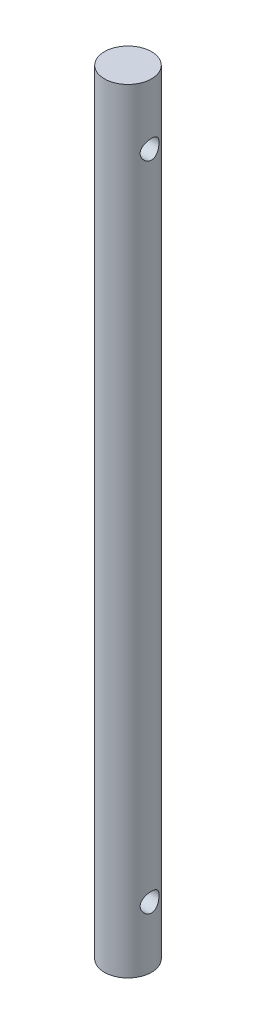
ISO-10303-21;
HEADER;
FILE_DESCRIPTION(('STEP AP214'),'2;1');
FILE_NAME('part.step','',(''),(''),'','','');
FILE_SCHEMA(('AUTOMOTIVE_DESIGN { 1 0 10303 214 1 1 1 1 }'));
ENDSEC;
DATA;
#1=APPLICATION_CONTEXT('core data for automotive mechanical design processes');
#2=APPLICATION_PROTOCOL_DEFINITION('international standard','automotive_design',2000,#1);
#3=PRODUCT_CONTEXT('',#1,'mechanical');
#4=PRODUCT('Part','Part','',(#3));
#5=PRODUCT_RELATED_PRODUCT_CATEGORY('part','',(#4));
#6=PRODUCT_DEFINITION_FORMATION('','',#4);
#7=PRODUCT_DEFINITION_CONTEXT('part definition',#1,'design');
#8=PRODUCT_DEFINITION('design','',#6,#7);
#9=PRODUCT_DEFINITION_SHAPE('','',#8);
#10=(LENGTH_UNIT() NAMED_UNIT(*) SI_UNIT(.MILLI.,.METRE.));
#11=(NAMED_UNIT(*) PLANE_ANGLE_UNIT() SI_UNIT($,.RADIAN.));
#12=(NAMED_UNIT(*) SI_UNIT($,.STERADIAN.) SOLID_ANGLE_UNIT());
#13=UNCERTAINTY_MEASURE_WITH_UNIT(LENGTH_MEASURE(1.E-05),#10,'distance_accuracy_value','');
#14=(GEOMETRIC_REPRESENTATION_CONTEXT(3) GLOBAL_UNCERTAINTY_ASSIGNED_CONTEXT((#13)) GLOBAL_UNIT_ASSIGNED_CONTEXT((#10,
#11,#12)) REPRESENTATION_CONTEXT('',''));
#15=CARTESIAN_POINT('',(0.,0.,0.));
#16=DIRECTION('',(0.,0.,1.));
#17=DIRECTION('',(1.,0.,0.));
#18=AXIS2_PLACEMENT_3D('',#15,#16,#17);
#19=CARTESIAN_POINT('',(0.,65.0875,0.));
#20=DIRECTION('',(0.,-1.,0.));
#21=DIRECTION('',(0.,0.,-1.));
#22=AXIS2_PLACEMENT_3D('',#19,#20,#21);
#23=CYLINDRICAL_SURFACE('',#22,3.9624);
#24=CARTESIAN_POINT('',(-3.9624,-56.4261,0.));
#25=CARTESIAN_POINT('',(-3.96239416664373,-56.4260921193011,-0.0853117270718665));
#26=CARTESIAN_POINT('',(-3.95961253187258,-56.4191820472601,-0.170771012783031));
#27=CARTESIAN_POINT('',(-3.94875664272095,-56.3917813319248,-0.339280209794603));
#28=CARTESIAN_POINT('',(-3.94066802223273,-56.3712538243066,-0.422322940365623));
#29=CARTESIAN_POINT('',(-3.92006972049317,-56.3174852905155,-0.583289939692177));
#30=CARTESIAN_POINT('',(-3.90757454272,-56.2842859425204,-0.661230017057725));
#31=CARTESIAN_POINT('',(-3.87939329710751,-56.206281808147,-0.810363301587508));
#32=CARTESIAN_POINT('',(-3.863708331934,-56.1614810307651,-0.881558827817694));
#33=CARTESIAN_POINT('',(-3.82990464333274,-56.0593098336145,-1.01864732948284));
#34=CARTESIAN_POINT('',(-3.81171021752443,-56.0014813356325,-1.08418010359646));
#35=CARTESIAN_POINT('',(-3.7752829774358,-55.8758631362575,-1.20492218930694));
#36=CARTESIAN_POINT('',(-3.75705014873227,-55.8080685767368,-1.26012643608791));
#37=CARTESIAN_POINT('',(-3.72170442663272,-55.660764437137,-1.36107386243811));
#38=CARTESIAN_POINT('',(-3.70467796939796,-55.5808667700026,-1.40628412127964));
#39=CARTESIAN_POINT('',(-3.67486086596433,-55.4138169679372,-1.48246329056709));
#40=CARTESIAN_POINT('',(-3.66206820228051,-55.3266683130901,-1.51343898680088));
#41=CARTESIAN_POINT('',(-3.64298009307872,-55.1517293799379,-1.55881183659324));
#42=CARTESIAN_POINT('',(-3.63641570103485,-55.0641484051034,-1.57389868874412));
#43=CARTESIAN_POINT('',(-3.62974807106187,-54.8874708701643,-1.58921987839996));
#44=CARTESIAN_POINT('',(-3.62964164180919,-54.7983750804086,-1.58946155192944));
#45=CARTESIAN_POINT('',(-3.6356726055801,-54.6278342294068,-1.575608087631));
#46=CARTESIAN_POINT('',(-3.64137433896396,-54.5462895020417,-1.56251330699091));
#47=CARTESIAN_POINT('',(-3.65764778306397,-54.3866700246874,-1.5240270084585));
#48=CARTESIAN_POINT('',(-3.66822034656052,-54.308595884951,-1.49863333724793));
#49=CARTESIAN_POINT('',(-3.69327658525766,-54.1562469972858,-1.43578621930772));
#50=CARTESIAN_POINT('',(-3.7078358006729,-54.0820825564207,-1.39809683496273));
#51=CARTESIAN_POINT('',(-3.73920425029953,-53.9408576430005,-1.31189385068063));
#52=CARTESIAN_POINT('',(-3.75601433031439,-53.8737998579535,-1.263376177224));
#53=CARTESIAN_POINT('',(-3.79157859533404,-53.7432177203381,-1.15247025125587));
#54=CARTESIAN_POINT('',(-3.81038243478568,-53.6803709868535,-1.08929797701746));
#55=CARTESIAN_POINT('',(-3.84670714404858,-53.565946296881,-0.953110948774039));
#56=CARTESIAN_POINT('',(-3.86422775624386,-53.5143705990245,-0.880094226746655));
#57=CARTESIAN_POINT('',(-3.89645338462923,-53.4230588621464,-0.724363732588357));
#58=CARTESIAN_POINT('',(-3.91109551133595,-53.3835785435517,-0.64148605770065));
#59=CARTESIAN_POINT('',(-3.93543864002888,-53.3193537921091,-0.469530085969014));
#60=CARTESIAN_POINT('',(-3.94514216003095,-53.2946018487075,-0.380454975359991));
#61=CARTESIAN_POINT('',(-3.95805539170234,-53.2619087183818,-0.204311847288934));
#62=CARTESIAN_POINT('',(-3.96161635318634,-53.2530569422447,-0.11743850460253));
#63=CARTESIAN_POINT('',(-3.96295024554235,-53.2497256723844,0.0566169135851256));
#64=CARTESIAN_POINT('',(-3.96072468264188,-53.2552424385421,0.143798902846544));
#65=CARTESIAN_POINT('',(-3.95096541555836,-53.279822787761,0.311864203819767));
#66=CARTESIAN_POINT('',(-3.94367566936803,-53.298264101533,0.392854247186952));
#67=CARTESIAN_POINT('',(-3.92477456539392,-53.3473226223705,0.550515216479772));
#68=CARTESIAN_POINT('',(-3.9131626527772,-53.3779413926807,0.62718558643701));
#69=CARTESIAN_POINT('',(-3.88630174678252,-53.4514847754524,0.776671825040636));
#70=CARTESIAN_POINT('',(-3.87095230097636,-53.4947573858859,0.84929786524366));
#71=CARTESIAN_POINT('',(-3.83827939599824,-53.5919941364002,0.986513042497237));
#72=CARTESIAN_POINT('',(-3.82095514553132,-53.6459625686897,1.05109893605944));
#73=CARTESIAN_POINT('',(-3.78479622435235,-53.767250435357,1.17488814946077));
#74=CARTESIAN_POINT('',(-3.76593750910618,-53.8352173731056,1.23345169378678));
#75=CARTESIAN_POINT('',(-3.72989598565993,-53.9803463207111,1.33849995110219));
#76=CARTESIAN_POINT('',(-3.71271345763364,-54.0575098630029,1.38498264693781));
#77=CARTESIAN_POINT('',(-3.68194013043205,-54.2200216147768,1.46485133239264));
#78=CARTESIAN_POINT('',(-3.66838637510373,-54.3054429536227,1.49810381591319));
#79=CARTESIAN_POINT('',(-3.64698112621987,-54.481379776943,1.5494941460913));
#80=CARTESIAN_POINT('',(-3.63912540623532,-54.5718914319467,1.56764319695997));
#81=CARTESIAN_POINT('',(-3.63061804319504,-54.7484018207046,1.58723971665741));
#82=CARTESIAN_POINT('',(-3.62948746901891,-54.8342549205638,1.58979784556331));
#83=CARTESIAN_POINT('',(-3.63330307077312,-55.0051066827267,1.58105828726621));
#84=CARTESIAN_POINT('',(-3.63824846948727,-55.0901054529112,1.56976237222211));
#85=CARTESIAN_POINT('',(-3.65323574640425,-55.2533688823369,1.53454341699212));
#86=CARTESIAN_POINT('',(-3.66306695290778,-55.3317669177528,1.51114082490251));
#87=CARTESIAN_POINT('',(-3.6865691443393,-55.4835546597423,1.45286057138561));
#88=CARTESIAN_POINT('',(-3.70024119029212,-55.556942975417,1.41797973865852));
#89=CARTESIAN_POINT('',(-3.73085856653308,-55.7012155266046,1.3354212120285));
#90=CARTESIAN_POINT('',(-3.74794669035745,-55.7717145315965,1.28712414414707));
#91=CARTESIAN_POINT('',(-3.78303688506396,-55.9039557778298,1.1800080827382));
#92=CARTESIAN_POINT('',(-3.8010392318397,-55.9656953540748,1.12118589927164));
#93=CARTESIAN_POINT('',(-3.83733892894263,-56.0827920022108,0.990129236409025));
#94=CARTESIAN_POINT('',(-3.85557912432534,-56.1374714588259,0.917270721586567));
#95=CARTESIAN_POINT('',(-3.88910173721633,-56.2338427946702,0.762721357089433));
#96=CARTESIAN_POINT('',(-3.90438277937339,-56.2755286402073,0.681026427799033));
#97=CARTESIAN_POINT('',(-3.93000833052496,-56.3437546874147,0.51261229318979));
#98=CARTESIAN_POINT('',(-3.94043917717235,-56.3705615688017,0.426014442405735));
#99=CARTESIAN_POINT('',(-3.95554325966711,-56.4090098677266,0.249201615949014));
#100=CARTESIAN_POINT('',(-3.96023475540089,-56.4206993883373,0.15899905958605));
#101=CARTESIAN_POINT('',(-3.96220361378713,-56.4256081223784,0.0457330899803838));
#102=CARTESIAN_POINT('',(-3.96240156390736,-56.4261021127945,0.0228718479665278));
#103=CARTESIAN_POINT('',(-3.9624,-56.4261,0.));
#104=B_SPLINE_CURVE_WITH_KNOTS('',3,(#24,#25,#26,#27,#28,#29,#30,#31,#32,#33,#34,#35,#36,#37,
#38,#39,#40,#41,#42,#43,#44,#45,#46,#47,#48,#49,#50,#51,#52,#53,#54,#55,#56,#57,#58,#59,#60,#61,
#62,#63,#64,#65,#66,#67,#68,#69,#70,#71,#72,#73,#74,#75,#76,#77,#78,#79,#80,#81,#82,#83,#84,#85,
#86,#87,#88,#89,#90,#91,#92,#93,#94,#95,#96,#97,#98,#99,#100,#101,#102,#103),.UNSPECIFIED.,.T.,
.F.,(4,2,2,2,2,2,2,2,2,2,2,2,2,2,2,2,2,2,2,2,2,2,2,2,2,2,2,2,2,2,2,2,2,2,2,2,2,2,2,4),(0.,
0.255873929494161,0.512443388183722,0.768176151866849,1.02382066204937,1.29047021362669,
1.55725018179777,1.83594980248179,2.11451642551444,2.38041834160663,2.64618885620301,
2.89339325556368,3.14064095169739,3.39294340285308,3.64534092872686,3.9173176007395,
4.18934872497149,4.46678713369947,4.74408394461068,5.0049220380686,5.2656922423836,
5.51470010088074,5.76373993534176,6.02040300035022,6.27716927297267,6.5509409411041,
6.82475829189514,7.10127261999538,7.37758163757343,7.63395264349522,7.89029085879073,
8.13642690153648,8.38263100588644,8.6429604535535,8.90336893560793,9.18073833868853,
9.45823634935121,9.73058529806194,10.0020654893605,10.0706646118358),.UNSPECIFIED.);
#105=CARTESIAN_POINT('',(-3.9624,-56.4261,0.));
#106=VERTEX_POINT('',#105);
#107=EDGE_CURVE('E37',#106,#106,#104,.T.);
#108=ORIENTED_EDGE('',*,*,#107,.T.);
#109=EDGE_LOOP('',(#108));
#110=FACE_BOUND('',#109,.T.);
#111=CARTESIAN_POINT('',(3.9624,-56.4261,0.));
#112=CARTESIAN_POINT('',(3.96239416664373,-56.4260921193011,0.0853117270718677));
#113=CARTESIAN_POINT('',(3.95961253187258,-56.4191820472601,0.170771012783033));
#114=CARTESIAN_POINT('',(3.94875664272095,-56.3917813319248,0.339280209794605));
#115=CARTESIAN_POINT('',(3.94066802223273,-56.3712538243066,0.422322940365624));
#116=CARTESIAN_POINT('',(3.92006972049317,-56.3174852905155,0.583289939692179));
#117=CARTESIAN_POINT('',(3.90757454272,-56.2842859425204,0.661230017057729));
#118=CARTESIAN_POINT('',(3.87939329710751,-56.206281808147,0.810363301587513));
#119=CARTESIAN_POINT('',(3.863708331934,-56.1614810307651,0.881558827817698));
#120=CARTESIAN_POINT('',(3.82990464333274,-56.0593098336145,1.01864732948285));
#121=CARTESIAN_POINT('',(3.81171021752442,-56.0014813356325,1.08418010359647));
#122=CARTESIAN_POINT('',(3.7752829774358,-55.8758631362575,1.20492218930694));
#123=CARTESIAN_POINT('',(3.75705014873227,-55.8080685767368,1.26012643608791));
#124=CARTESIAN_POINT('',(3.72170442663272,-55.660764437137,1.36107386243811));
#125=CARTESIAN_POINT('',(3.70467796939796,-55.5808667700026,1.40628412127964));
#126=CARTESIAN_POINT('',(3.67486086596433,-55.4138169679372,1.48246329056709));
#127=CARTESIAN_POINT('',(3.66206820228051,-55.3266683130901,1.51343898680088));
#128=CARTESIAN_POINT('',(3.64298009307872,-55.1517293799379,1.55881183659324));
#129=CARTESIAN_POINT('',(3.63641570103485,-55.0641484051034,1.57389868874411));
#130=CARTESIAN_POINT('',(3.62974807106188,-54.8874708701643,1.58921987839996));
#131=CARTESIAN_POINT('',(3.62964164180919,-54.7983750804086,1.58946155192944));
#132=CARTESIAN_POINT('',(3.6356726055801,-54.6278342294068,1.575608087631));
#133=CARTESIAN_POINT('',(3.64137433896395,-54.5462895020417,1.56251330699091));
#134=CARTESIAN_POINT('',(3.65764778306397,-54.3866700246874,1.5240270084585));
#135=CARTESIAN_POINT('',(3.66822034656052,-54.308595884951,1.49863333724793));
#136=CARTESIAN_POINT('',(3.69327658525766,-54.1562469972858,1.43578621930772));
#137=CARTESIAN_POINT('',(3.7078358006729,-54.0820825564207,1.39809683496273));
#138=CARTESIAN_POINT('',(3.73920425029953,-53.9408576430005,1.31189385068063));
#139=CARTESIAN_POINT('',(3.75601433031439,-53.8737998579535,1.263376177224));
#140=CARTESIAN_POINT('',(3.79157859533404,-53.7432177203381,1.15247025125587));
#141=CARTESIAN_POINT('',(3.81038243478568,-53.6803709868535,1.08929797701747));
#142=CARTESIAN_POINT('',(3.84670714404858,-53.565946296881,0.95311094877404));
#143=CARTESIAN_POINT('',(3.86422775624386,-53.5143705990245,0.880094226746653));
#144=CARTESIAN_POINT('',(3.89645338462923,-53.4230588621464,0.724363732588353));
#145=CARTESIAN_POINT('',(3.91109551133595,-53.3835785435517,0.641486057700646));
#146=CARTESIAN_POINT('',(3.93543864002888,-53.3193537921091,0.469530085969011));
#147=CARTESIAN_POINT('',(3.94514216003095,-53.2946018487075,0.380454975359989));
#148=CARTESIAN_POINT('',(3.95805539170234,-53.2619087183818,0.204311847288932));
#149=CARTESIAN_POINT('',(3.96161635318634,-53.2530569422447,0.117438504602528));
#150=CARTESIAN_POINT('',(3.96295024554235,-53.2497256723844,-0.0566169135851276));
#151=CARTESIAN_POINT('',(3.96072468264188,-53.2552424385421,-0.143798902846546));
#152=CARTESIAN_POINT('',(3.95096541555836,-53.279822787761,-0.311864203819769));
#153=CARTESIAN_POINT('',(3.94367566936803,-53.298264101533,-0.392854247186953));
#154=CARTESIAN_POINT('',(3.92477456539392,-53.3473226223705,-0.550515216479773));
#155=CARTESIAN_POINT('',(3.9131626527772,-53.3779413926807,-0.62718558643701));
#156=CARTESIAN_POINT('',(3.88630174678252,-53.4514847754524,-0.776671825040635));
#157=CARTESIAN_POINT('',(3.87095230097636,-53.4947573858859,-0.849297865243656));
#158=CARTESIAN_POINT('',(3.83827939599824,-53.5919941364002,-0.986513042497233));
#159=CARTESIAN_POINT('',(3.82095514553132,-53.6459625686897,-1.05109893605943));
#160=CARTESIAN_POINT('',(3.78479622435235,-53.767250435357,-1.17488814946077));
#161=CARTESIAN_POINT('',(3.76593750910618,-53.8352173731056,-1.23345169378678));
#162=CARTESIAN_POINT('',(3.72989598565993,-53.9803463207111,-1.3384999511022));
#163=CARTESIAN_POINT('',(3.71271345763364,-54.0575098630029,-1.38498264693781));
#164=CARTESIAN_POINT('',(3.68194013043205,-54.2200216147768,-1.46485133239264));
#165=CARTESIAN_POINT('',(3.66838637510373,-54.3054429536227,-1.49810381591319));
#166=CARTESIAN_POINT('',(3.64698112621987,-54.481379776943,-1.5494941460913));
#167=CARTESIAN_POINT('',(3.63912540623532,-54.5718914319467,-1.56764319695997));
#168=CARTESIAN_POINT('',(3.63061804319505,-54.7484018207046,-1.58723971665741));
#169=CARTESIAN_POINT('',(3.62948746901891,-54.8342549205638,-1.58979784556331));
#170=CARTESIAN_POINT('',(3.63330307077312,-55.0051066827267,-1.58105828726621));
#171=CARTESIAN_POINT('',(3.63824846948727,-55.0901054529112,-1.56976237222211));
#172=CARTESIAN_POINT('',(3.65323574640425,-55.2533688823369,-1.53454341699212));
#173=CARTESIAN_POINT('',(3.66306695290778,-55.3317669177528,-1.51114082490251));
#174=CARTESIAN_POINT('',(3.6865691443393,-55.4835546597423,-1.45286057138561));
#175=CARTESIAN_POINT('',(3.70024119029212,-55.556942975417,-1.41797973865852));
#176=CARTESIAN_POINT('',(3.73085856653308,-55.7012155266046,-1.3354212120285));
#177=CARTESIAN_POINT('',(3.74794669035745,-55.7717145315965,-1.28712414414707));
#178=CARTESIAN_POINT('',(3.78303688506396,-55.9039557778298,-1.1800080827382));
#179=CARTESIAN_POINT('',(3.8010392318397,-55.9656953540748,-1.12118589927164));
#180=CARTESIAN_POINT('',(3.83733892894263,-56.0827920022108,-0.990129236409029));
#181=CARTESIAN_POINT('',(3.85557912432534,-56.1374714588259,-0.917270721586572));
#182=CARTESIAN_POINT('',(3.88910173721633,-56.2338427946702,-0.762721357089438));
#183=CARTESIAN_POINT('',(3.90438277937339,-56.2755286402073,-0.681026427799036));
#184=CARTESIAN_POINT('',(3.93000833052496,-56.3437546874147,-0.512612293189792));
#185=CARTESIAN_POINT('',(3.94043917717235,-56.3705615688017,-0.426014442405737));
#186=CARTESIAN_POINT('',(3.95554325966711,-56.4090098677266,-0.249201615949017));
#187=CARTESIAN_POINT('',(3.96023475540089,-56.4206993883374,-0.158999059586053));
#188=CARTESIAN_POINT('',(3.96220361378713,-56.4256081223784,-0.045733089980386));
#189=CARTESIAN_POINT('',(3.96240156390736,-56.4261021127945,-0.0228718479665289));
#190=CARTESIAN_POINT('',(3.9624,-56.4261,0.));
#191=B_SPLINE_CURVE_WITH_KNOTS('',3,(#111,#112,#113,#114,#115,#116,#117,#118,#119,#120,#121,
#122,#123,#124,#125,#126,#127,#128,#129,#130,#131,#132,#133,#134,#135,#136,#137,#138,#139,#140,
#141,#142,#143,#144,#145,#146,#147,#148,#149,#150,#151,#152,#153,#154,#155,#156,#157,#158,#159,
#160,#161,#162,#163,#164,#165,#166,#167,#168,#169,#170,#171,#172,#173,#174,#175,#176,#177,#178,
#179,#180,#181,#182,#183,#184,#185,#186,#187,#188,#189,#190),.UNSPECIFIED.,.T.,.F.,(4,2,2,2,2,2,
2,2,2,2,2,2,2,2,2,2,2,2,2,2,2,2,2,2,2,2,2,2,2,2,2,2,2,2,2,2,2,2,2,4),(0.,0.255873929494164,
0.512443388183723,0.768176151866854,1.02382066204937,1.2904702136267,1.55725018179777,
1.83594980248179,2.11451642551444,2.38041834160661,2.646188856203,2.89339325556368,
3.14064095169739,3.39294340285308,3.64534092872686,3.91731760073949,4.18934872497149,
4.46678713369947,4.74408394461068,5.0049220380686,5.2656922423836,5.51470010088074,
5.76373993534176,6.02040300035021,6.27716927297267,6.5509409411041,6.82475829189514,
7.10127261999537,7.37758163757341,7.63395264349521,7.89029085879072,8.13642690153648,
8.38263100588644,8.64296045355349,8.90336893560792,9.18073833868852,9.45823634935121,
9.73058529806194,10.0020654893604,10.0706646118358),.UNSPECIFIED.);
#192=CARTESIAN_POINT('',(3.9624,-56.4261,0.));
#193=VERTEX_POINT('',#192);
#194=EDGE_CURVE('E89',#193,#193,#191,.T.);
#195=ORIENTED_EDGE('',*,*,#194,.T.);
#196=EDGE_LOOP('',(#195));
#197=FACE_BOUND('',#196,.T.);
#198=CARTESIAN_POINT('',(-3.9624,56.4261,0.));
#199=CARTESIAN_POINT('',(-3.96239416664373,56.4260921193011,0.0853117270718665));
#200=CARTESIAN_POINT('',(-3.95961253187258,56.4191820472601,0.170771012783031));
#201=CARTESIAN_POINT('',(-3.94875664272095,56.3917813319248,0.339280209794603));
#202=CARTESIAN_POINT('',(-3.94066802223273,56.3712538243066,0.422322940365623));
#203=CARTESIAN_POINT('',(-3.92006972049317,56.3174852905155,0.583289939692177));
#204=CARTESIAN_POINT('',(-3.90757454272,56.2842859425204,0.661230017057725));
#205=CARTESIAN_POINT('',(-3.87939329710751,56.206281808147,0.810363301587508));
#206=CARTESIAN_POINT('',(-3.863708331934,56.1614810307651,0.881558827817694));
#207=CARTESIAN_POINT('',(-3.82990464333274,56.0593098336145,1.01864732948284));
#208=CARTESIAN_POINT('',(-3.81171021752443,56.0014813356325,1.08418010359646));
#209=CARTESIAN_POINT('',(-3.7752829774358,55.8758631362575,1.20492218930694));
#210=CARTESIAN_POINT('',(-3.75705014873227,55.8080685767368,1.26012643608791));
#211=CARTESIAN_POINT('',(-3.72170442663272,55.660764437137,1.36107386243811));
#212=CARTESIAN_POINT('',(-3.70467796939796,55.5808667700026,1.40628412127964));
#213=CARTESIAN_POINT('',(-3.67486086596433,55.4138169679372,1.48246329056709));
#214=CARTESIAN_POINT('',(-3.66206820228051,55.3266683130901,1.51343898680088));
#215=CARTESIAN_POINT('',(-3.64298009307872,55.1517293799379,1.55881183659324));
#216=CARTESIAN_POINT('',(-3.63641570103485,55.0641484051034,1.57389868874412));
#217=CARTESIAN_POINT('',(-3.62974807106187,54.8874708701643,1.58921987839996));
#218=CARTESIAN_POINT('',(-3.62964164180919,54.7983750804086,1.58946155192944));
#219=CARTESIAN_POINT('',(-3.6356726055801,54.6278342294068,1.575608087631));
#220=CARTESIAN_POINT('',(-3.64137433896396,54.5462895020417,1.56251330699091));
#221=CARTESIAN_POINT('',(-3.65764778306397,54.3866700246874,1.5240270084585));
#222=CARTESIAN_POINT('',(-3.66822034656052,54.308595884951,1.49863333724793));
#223=CARTESIAN_POINT('',(-3.69327658525766,54.1562469972858,1.43578621930772));
#224=CARTESIAN_POINT('',(-3.7078358006729,54.0820825564207,1.39809683496273));
#225=CARTESIAN_POINT('',(-3.73920425029953,53.9408576430005,1.31189385068063));
#226=CARTESIAN_POINT('',(-3.75601433031439,53.8737998579535,1.263376177224));
#227=CARTESIAN_POINT('',(-3.79157859533404,53.7432177203381,1.15247025125587));
#228=CARTESIAN_POINT('',(-3.81038243478568,53.6803709868535,1.08929797701746));
#229=CARTESIAN_POINT('',(-3.84670714404858,53.565946296881,0.953110948774039));
#230=CARTESIAN_POINT('',(-3.86422775624386,53.5143705990245,0.880094226746655));
#231=CARTESIAN_POINT('',(-3.89645338462923,53.4230588621464,0.724363732588357));
#232=CARTESIAN_POINT('',(-3.91109551133595,53.3835785435517,0.64148605770065));
#233=CARTESIAN_POINT('',(-3.93543864002888,53.3193537921091,0.469530085969014));
#234=CARTESIAN_POINT('',(-3.94514216003095,53.2946018487075,0.380454975359991));
#235=CARTESIAN_POINT('',(-3.95805539170234,53.2619087183818,0.204311847288934));
#236=CARTESIAN_POINT('',(-3.96161635318634,53.2530569422447,0.11743850460253));
#237=CARTESIAN_POINT('',(-3.96295024554235,53.2497256723844,-0.0566169135851256));
#238=CARTESIAN_POINT('',(-3.96072468264188,53.2552424385421,-0.143798902846544));
#239=CARTESIAN_POINT('',(-3.95096541555836,53.279822787761,-0.311864203819767));
#240=CARTESIAN_POINT('',(-3.94367566936803,53.298264101533,-0.392854247186952));
#241=CARTESIAN_POINT('',(-3.92477456539392,53.3473226223705,-0.550515216479772));
#242=CARTESIAN_POINT('',(-3.9131626527772,53.3779413926807,-0.62718558643701));
#243=CARTESIAN_POINT('',(-3.88630174678252,53.4514847754524,-0.776671825040636));
#244=CARTESIAN_POINT('',(-3.87095230097636,53.4947573858859,-0.84929786524366));
#245=CARTESIAN_POINT('',(-3.83827939599824,53.5919941364002,-0.986513042497237));
#246=CARTESIAN_POINT('',(-3.82095514553132,53.6459625686897,-1.05109893605944));
#247=CARTESIAN_POINT('',(-3.78479622435235,53.767250435357,-1.17488814946077));
#248=CARTESIAN_POINT('',(-3.76593750910618,53.8352173731056,-1.23345169378678));
#249=CARTESIAN_POINT('',(-3.72989598565993,53.9803463207111,-1.33849995110219));
#250=CARTESIAN_POINT('',(-3.71271345763364,54.0575098630029,-1.38498264693781));
#251=CARTESIAN_POINT('',(-3.68194013043205,54.2200216147768,-1.46485133239264));
#252=CARTESIAN_POINT('',(-3.66838637510373,54.3054429536227,-1.49810381591319));
#253=CARTESIAN_POINT('',(-3.64698112621987,54.481379776943,-1.5494941460913));
#254=CARTESIAN_POINT('',(-3.63912540623532,54.5718914319467,-1.56764319695997));
#255=CARTESIAN_POINT('',(-3.63061804319504,54.7484018207046,-1.58723971665741));
#256=CARTESIAN_POINT('',(-3.62948746901891,54.8342549205638,-1.58979784556331));
#257=CARTESIAN_POINT('',(-3.63330307077312,55.0051066827267,-1.58105828726621));
#258=CARTESIAN_POINT('',(-3.63824846948727,55.0901054529112,-1.56976237222211));
#259=CARTESIAN_POINT('',(-3.65323574640425,55.2533688823369,-1.53454341699212));
#260=CARTESIAN_POINT('',(-3.66306695290778,55.3317669177528,-1.51114082490251));
#261=CARTESIAN_POINT('',(-3.6865691443393,55.4835546597423,-1.45286057138561));
#262=CARTESIAN_POINT('',(-3.70024119029212,55.556942975417,-1.41797973865852));
#263=CARTESIAN_POINT('',(-3.73085856653308,55.7012155266046,-1.3354212120285));
#264=CARTESIAN_POINT('',(-3.74794669035745,55.7717145315965,-1.28712414414707));
#265=CARTESIAN_POINT('',(-3.78303688506396,55.9039557778298,-1.1800080827382));
#266=CARTESIAN_POINT('',(-3.8010392318397,55.9656953540748,-1.12118589927164));
#267=CARTESIAN_POINT('',(-3.83733892894263,56.0827920022108,-0.990129236409025));
#268=CARTESIAN_POINT('',(-3.85557912432534,56.1374714588259,-0.917270721586567));
#269=CARTESIAN_POINT('',(-3.88910173721633,56.2338427946702,-0.762721357089433));
#270=CARTESIAN_POINT('',(-3.90438277937339,56.2755286402073,-0.681026427799033));
#271=CARTESIAN_POINT('',(-3.93000833052496,56.3437546874147,-0.51261229318979));
#272=CARTESIAN_POINT('',(-3.94043917717235,56.3705615688017,-0.426014442405735));
#273=CARTESIAN_POINT('',(-3.95554325966711,56.4090098677266,-0.249201615949014));
#274=CARTESIAN_POINT('',(-3.96023475540089,56.4206993883373,-0.15899905958605));
#275=CARTESIAN_POINT('',(-3.96220361378713,56.4256081223784,-0.0457330899803838));
#276=CARTESIAN_POINT('',(-3.96240156390736,56.4261021127945,-0.0228718479665278));
#277=CARTESIAN_POINT('',(-3.9624,56.4261,0.));
#278=B_SPLINE_CURVE_WITH_KNOTS('',3,(#198,#199,#200,#201,#202,#203,#204,#205,#206,#207,#208,
#209,#210,#211,#212,#213,#214,#215,#216,#217,#218,#219,#220,#221,#222,#223,#224,#225,#226,#227,
#228,#229,#230,#231,#232,#233,#234,#235,#236,#237,#238,#239,#240,#241,#242,#243,#244,#245,#246,
#247,#248,#249,#250,#251,#252,#253,#254,#255,#256,#257,#258,#259,#260,#261,#262,#263,#264,#265,
#266,#267,#268,#269,#270,#271,#272,#273,#274,#275,#276,#277),.UNSPECIFIED.,.T.,.F.,(4,2,2,2,2,2,
2,2,2,2,2,2,2,2,2,2,2,2,2,2,2,2,2,2,2,2,2,2,2,2,2,2,2,2,2,2,2,2,2,4),(0.,0.255873929494161,
0.512443388183722,0.768176151866849,1.02382066204937,1.29047021362669,1.55725018179777,
1.83594980248179,2.11451642551444,2.38041834160663,2.64618885620301,2.89339325556368,
3.14064095169739,3.39294340285308,3.64534092872686,3.9173176007395,4.18934872497149,
4.46678713369947,4.74408394461068,5.0049220380686,5.2656922423836,5.51470010088074,
5.76373993534176,6.02040300035022,6.27716927297267,6.5509409411041,6.82475829189514,
7.10127261999538,7.37758163757343,7.63395264349522,7.89029085879073,8.13642690153648,
8.38263100588644,8.6429604535535,8.90336893560793,9.18073833868853,9.45823634935121,
9.73058529806194,10.0020654893605,10.0706646118358),.UNSPECIFIED.);
#279=CARTESIAN_POINT('',(-3.9624,56.4261,0.));
#280=VERTEX_POINT('',#279);
#281=EDGE_CURVE('E50',#280,#280,#278,.T.);
#282=ORIENTED_EDGE('',*,*,#281,.T.);
#283=EDGE_LOOP('',(#282));
#284=FACE_BOUND('',#283,.T.);
#285=CARTESIAN_POINT('',(3.9624,56.4261,0.));
#286=CARTESIAN_POINT('',(3.96239416664373,56.4260921193011,-0.0853117270718677));
#287=CARTESIAN_POINT('',(3.95961253187258,56.4191820472601,-0.170771012783033));
#288=CARTESIAN_POINT('',(3.94875664272095,56.3917813319248,-0.339280209794605));
#289=CARTESIAN_POINT('',(3.94066802223273,56.3712538243066,-0.422322940365624));
#290=CARTESIAN_POINT('',(3.92006972049317,56.3174852905155,-0.583289939692179));
#291=CARTESIAN_POINT('',(3.90757454272,56.2842859425204,-0.661230017057729));
#292=CARTESIAN_POINT('',(3.87939329710751,56.206281808147,-0.810363301587513));
#293=CARTESIAN_POINT('',(3.863708331934,56.1614810307651,-0.881558827817698));
#294=CARTESIAN_POINT('',(3.82990464333274,56.0593098336145,-1.01864732948285));
#295=CARTESIAN_POINT('',(3.81171021752442,56.0014813356325,-1.08418010359647));
#296=CARTESIAN_POINT('',(3.7752829774358,55.8758631362575,-1.20492218930694));
#297=CARTESIAN_POINT('',(3.75705014873227,55.8080685767368,-1.26012643608791));
#298=CARTESIAN_POINT('',(3.72170442663272,55.660764437137,-1.36107386243811));
#299=CARTESIAN_POINT('',(3.70467796939796,55.5808667700026,-1.40628412127964));
#300=CARTESIAN_POINT('',(3.67486086596433,55.4138169679372,-1.48246329056709));
#301=CARTESIAN_POINT('',(3.66206820228051,55.3266683130901,-1.51343898680088));
#302=CARTESIAN_POINT('',(3.64298009307872,55.1517293799379,-1.55881183659324));
#303=CARTESIAN_POINT('',(3.63641570103485,55.0641484051034,-1.57389868874411));
#304=CARTESIAN_POINT('',(3.62974807106188,54.8874708701643,-1.58921987839996));
#305=CARTESIAN_POINT('',(3.62964164180919,54.7983750804086,-1.58946155192944));
#306=CARTESIAN_POINT('',(3.6356726055801,54.6278342294068,-1.575608087631));
#307=CARTESIAN_POINT('',(3.64137433896395,54.5462895020417,-1.56251330699091));
#308=CARTESIAN_POINT('',(3.65764778306397,54.3866700246874,-1.5240270084585));
#309=CARTESIAN_POINT('',(3.66822034656052,54.308595884951,-1.49863333724793));
#310=CARTESIAN_POINT('',(3.69327658525766,54.1562469972858,-1.43578621930772));
#311=CARTESIAN_POINT('',(3.7078358006729,54.0820825564207,-1.39809683496273));
#312=CARTESIAN_POINT('',(3.73920425029953,53.9408576430005,-1.31189385068063));
#313=CARTESIAN_POINT('',(3.75601433031439,53.8737998579535,-1.263376177224));
#314=CARTESIAN_POINT('',(3.79157859533404,53.7432177203381,-1.15247025125587));
#315=CARTESIAN_POINT('',(3.81038243478568,53.6803709868535,-1.08929797701747));
#316=CARTESIAN_POINT('',(3.84670714404858,53.565946296881,-0.95311094877404));
#317=CARTESIAN_POINT('',(3.86422775624386,53.5143705990245,-0.880094226746653));
#318=CARTESIAN_POINT('',(3.89645338462923,53.4230588621464,-0.724363732588353));
#319=CARTESIAN_POINT('',(3.91109551133595,53.3835785435517,-0.641486057700646));
#320=CARTESIAN_POINT('',(3.93543864002888,53.3193537921091,-0.469530085969011));
#321=CARTESIAN_POINT('',(3.94514216003095,53.2946018487075,-0.380454975359989));
#322=CARTESIAN_POINT('',(3.95805539170234,53.2619087183818,-0.204311847288932));
#323=CARTESIAN_POINT('',(3.96161635318634,53.2530569422447,-0.117438504602528));
#324=CARTESIAN_POINT('',(3.96295024554235,53.2497256723844,0.0566169135851276));
#325=CARTESIAN_POINT('',(3.96072468264188,53.2552424385421,0.143798902846546));
#326=CARTESIAN_POINT('',(3.95096541555836,53.279822787761,0.311864203819769));
#327=CARTESIAN_POINT('',(3.94367566936803,53.298264101533,0.392854247186953));
#328=CARTESIAN_POINT('',(3.92477456539392,53.3473226223705,0.550515216479773));
#329=CARTESIAN_POINT('',(3.9131626527772,53.3779413926807,0.62718558643701));
#330=CARTESIAN_POINT('',(3.88630174678252,53.4514847754524,0.776671825040635));
#331=CARTESIAN_POINT('',(3.87095230097636,53.4947573858859,0.849297865243656));
#332=CARTESIAN_POINT('',(3.83827939599824,53.5919941364002,0.986513042497233));
#333=CARTESIAN_POINT('',(3.82095514553132,53.6459625686897,1.05109893605943));
#334=CARTESIAN_POINT('',(3.78479622435235,53.767250435357,1.17488814946077));
#335=CARTESIAN_POINT('',(3.76593750910618,53.8352173731056,1.23345169378678));
#336=CARTESIAN_POINT('',(3.72989598565993,53.9803463207111,1.3384999511022));
#337=CARTESIAN_POINT('',(3.71271345763364,54.0575098630029,1.38498264693781));
#338=CARTESIAN_POINT('',(3.68194013043205,54.2200216147768,1.46485133239264));
#339=CARTESIAN_POINT('',(3.66838637510373,54.3054429536227,1.49810381591319));
#340=CARTESIAN_POINT('',(3.64698112621987,54.481379776943,1.5494941460913));
#341=CARTESIAN_POINT('',(3.63912540623532,54.5718914319467,1.56764319695997));
#342=CARTESIAN_POINT('',(3.63061804319505,54.7484018207046,1.58723971665741));
#343=CARTESIAN_POINT('',(3.62948746901891,54.8342549205638,1.58979784556331));
#344=CARTESIAN_POINT('',(3.63330307077312,55.0051066827267,1.58105828726621));
#345=CARTESIAN_POINT('',(3.63824846948727,55.0901054529112,1.56976237222211));
#346=CARTESIAN_POINT('',(3.65323574640425,55.2533688823369,1.53454341699212));
#347=CARTESIAN_POINT('',(3.66306695290778,55.3317669177528,1.51114082490251));
#348=CARTESIAN_POINT('',(3.6865691443393,55.4835546597423,1.45286057138561));
#349=CARTESIAN_POINT('',(3.70024119029212,55.556942975417,1.41797973865852));
#350=CARTESIAN_POINT('',(3.73085856653308,55.7012155266046,1.3354212120285));
#351=CARTESIAN_POINT('',(3.74794669035745,55.7717145315965,1.28712414414707));
#352=CARTESIAN_POINT('',(3.78303688506396,55.9039557778298,1.1800080827382));
#353=CARTESIAN_POINT('',(3.8010392318397,55.9656953540748,1.12118589927164));
#354=CARTESIAN_POINT('',(3.83733892894263,56.0827920022108,0.990129236409029));
#355=CARTESIAN_POINT('',(3.85557912432534,56.1374714588259,0.917270721586572));
#356=CARTESIAN_POINT('',(3.88910173721633,56.2338427946702,0.762721357089438));
#357=CARTESIAN_POINT('',(3.90438277937339,56.2755286402073,0.681026427799036));
#358=CARTESIAN_POINT('',(3.93000833052496,56.3437546874147,0.512612293189792));
#359=CARTESIAN_POINT('',(3.94043917717235,56.3705615688017,0.426014442405737));
#360=CARTESIAN_POINT('',(3.95554325966711,56.4090098677266,0.249201615949017));
#361=CARTESIAN_POINT('',(3.96023475540089,56.4206993883374,0.158999059586053));
#362=CARTESIAN_POINT('',(3.96220361378713,56.4256081223784,0.045733089980386));
#363=CARTESIAN_POINT('',(3.96240156390736,56.4261021127945,0.0228718479665289));
#364=CARTESIAN_POINT('',(3.9624,56.4261,0.));
#365=B_SPLINE_CURVE_WITH_KNOTS('',3,(#285,#286,#287,#288,#289,#290,#291,#292,#293,#294,#295,
#296,#297,#298,#299,#300,#301,#302,#303,#304,#305,#306,#307,#308,#309,#310,#311,#312,#313,#314,
#315,#316,#317,#318,#319,#320,#321,#322,#323,#324,#325,#326,#327,#328,#329,#330,#331,#332,#333,
#334,#335,#336,#337,#338,#339,#340,#341,#342,#343,#344,#345,#346,#347,#348,#349,#350,#351,#352,
#353,#354,#355,#356,#357,#358,#359,#360,#361,#362,#363,#364),.UNSPECIFIED.,.T.,.F.,(4,2,2,2,2,2,
2,2,2,2,2,2,2,2,2,2,2,2,2,2,2,2,2,2,2,2,2,2,2,2,2,2,2,2,2,2,2,2,2,4),(0.,0.255873929494164,
0.512443388183723,0.768176151866854,1.02382066204937,1.2904702136267,1.55725018179777,
1.83594980248179,2.11451642551444,2.38041834160661,2.646188856203,2.89339325556368,
3.14064095169739,3.39294340285308,3.64534092872686,3.91731760073949,4.18934872497149,
4.46678713369947,4.74408394461068,5.0049220380686,5.2656922423836,5.51470010088074,
5.76373993534176,6.02040300035021,6.27716927297267,6.5509409411041,6.82475829189514,
7.10127261999537,7.37758163757341,7.63395264349521,7.89029085879072,8.13642690153648,
8.38263100588644,8.64296045355349,8.90336893560792,9.18073833868852,9.45823634935121,
9.73058529806194,10.0020654893604,10.0706646118358),.UNSPECIFIED.);
#366=CARTESIAN_POINT('',(3.9624,56.4261,0.));
#367=VERTEX_POINT('',#366);
#368=EDGE_CURVE('E53',#367,#367,#365,.T.);
#369=ORIENTED_EDGE('',*,*,#368,.T.);
#370=EDGE_LOOP('',(#369));
#371=FACE_BOUND('',#370,.T.);
#372=CARTESIAN_POINT('',(0.,65.0875,0.));
#373=DIRECTION('',(0.,1.,0.));
#374=DIRECTION('',(0.,0.,1.));
#375=AXIS2_PLACEMENT_3D('',#372,#373,#374);
#376=CIRCLE('',#375,3.9624);
#377=CARTESIAN_POINT('',(0.,65.0875,3.9624));
#378=VERTEX_POINT('',#377);
#379=EDGE_CURVE('E10',#378,#378,#376,.T.);
#380=ORIENTED_EDGE('',*,*,#379,.F.);
#381=EDGE_LOOP('',(#380));
#382=FACE_BOUND('',#381,.T.);
#383=CARTESIAN_POINT('',(0.,-65.0875,0.));
#384=DIRECTION('',(0.,1.,0.));
#385=DIRECTION('',(0.,0.,1.));
#386=AXIS2_PLACEMENT_3D('',#383,#384,#385);
#387=CIRCLE('',#386,3.9624);
#388=CARTESIAN_POINT('',(0.,-65.0875,3.9624));
#389=VERTEX_POINT('',#388);
#390=EDGE_CURVE('E45',#389,#389,#387,.T.);
#391=ORIENTED_EDGE('',*,*,#390,.T.);
#392=EDGE_LOOP('',(#391));
#393=FACE_BOUND('',#392,.T.);
#394=ADVANCED_FACE('F33',(#110,#197,#284,#371,#382,#393),#23,.T.);
#395=CARTESIAN_POINT('',(0.,65.0875,0.));
#396=DIRECTION('',(0.,1.,0.));
#397=DIRECTION('',(0.,0.,1.));
#398=AXIS2_PLACEMENT_3D('',#395,#396,#397);
#399=PLANE('',#398);
#400=ORIENTED_EDGE('',*,*,#379,.T.);
#401=EDGE_LOOP('',(#400));
#402=FACE_BOUND('',#401,.T.);
#403=ADVANCED_FACE('F71',(#402),#399,.T.);
#404=CARTESIAN_POINT('',(0.,-65.0875,0.));
#405=DIRECTION('',(0.,1.,0.));
#406=DIRECTION('',(0.,0.,1.));
#407=AXIS2_PLACEMENT_3D('',#404,#405,#406);
#408=PLANE('',#407);
#409=ORIENTED_EDGE('',*,*,#390,.F.);
#410=EDGE_LOOP('',(#409));
#411=FACE_BOUND('',#410,.T.);
#412=ADVANCED_FACE('F68',(#411),#408,.F.);
#413=CARTESIAN_POINT('',(8.51340402915998,54.8386,0.));
#414=DIRECTION('',(1.,0.,0.));
#415=DIRECTION('',(0.,1.,0.));
#416=AXIS2_PLACEMENT_3D('',#413,#414,#415);
#417=CYLINDRICAL_SURFACE('',#416,1.5875);
#418=ORIENTED_EDGE('',*,*,#368,.F.);
#419=EDGE_LOOP('',(#418));
#420=FACE_BOUND('',#419,.T.);
#421=ORIENTED_EDGE('',*,*,#281,.F.);
#422=EDGE_LOOP('',(#421));
#423=FACE_BOUND('',#422,.T.);
#424=ADVANCED_FACE('F63',(#420,#423),#417,.F.);
#425=CARTESIAN_POINT('',(8.51340402915998,-54.8386,0.));
#426=DIRECTION('',(1.,0.,0.));
#427=DIRECTION('',(0.,-1.,0.));
#428=AXIS2_PLACEMENT_3D('',#425,#426,#427);
#429=CYLINDRICAL_SURFACE('',#428,1.5875);
#430=ORIENTED_EDGE('',*,*,#194,.F.);
#431=EDGE_LOOP('',(#430));
#432=FACE_BOUND('',#431,.T.);
#433=ORIENTED_EDGE('',*,*,#107,.F.);
#434=EDGE_LOOP('',(#433));
#435=FACE_BOUND('',#434,.T.);
#436=ADVANCED_FACE('F67',(#432,#435),#429,.F.);
#437=CLOSED_SHELL('',(#394,#403,#412,#424,#436));
#438=MANIFOLD_SOLID_BREP('B2',#437);
#439=ADVANCED_BREP_SHAPE_REPRESENTATION('',(#18,#438),#14);
#440=SHAPE_DEFINITION_REPRESENTATION(#9,#439);
ENDSEC;
END-ISO-10303-21;
